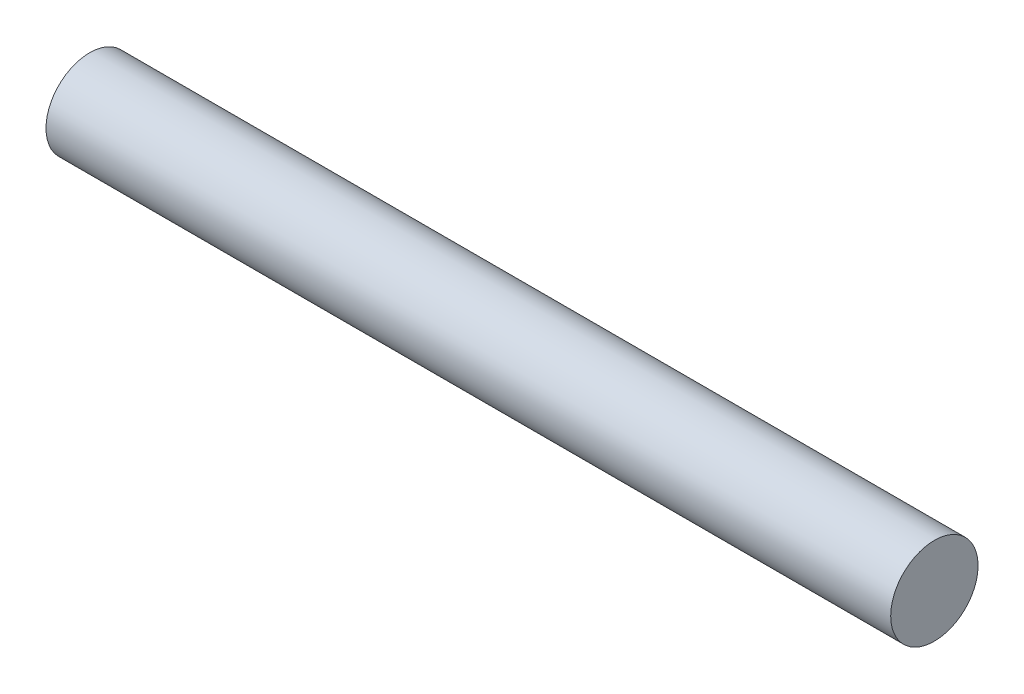
ISO-10303-21;
HEADER;
FILE_DESCRIPTION(('STEP AP214'),'2;1');
FILE_NAME('part.step','',(''),(''),'','','');
FILE_SCHEMA(('AUTOMOTIVE_DESIGN { 1 0 10303 214 1 1 1 1 }'));
ENDSEC;
DATA;
#1=APPLICATION_CONTEXT('core data for automotive mechanical design processes');
#2=APPLICATION_PROTOCOL_DEFINITION('international standard','automotive_design',2000,#1);
#3=PRODUCT_CONTEXT('',#1,'mechanical');
#4=PRODUCT('Part','Part','',(#3));
#5=PRODUCT_RELATED_PRODUCT_CATEGORY('part','',(#4));
#6=PRODUCT_DEFINITION_FORMATION('','',#4);
#7=PRODUCT_DEFINITION_CONTEXT('part definition',#1,'design');
#8=PRODUCT_DEFINITION('design','',#6,#7);
#9=PRODUCT_DEFINITION_SHAPE('','',#8);
#10=(LENGTH_UNIT() NAMED_UNIT(*) SI_UNIT(.MILLI.,.METRE.));
#11=(NAMED_UNIT(*) PLANE_ANGLE_UNIT() SI_UNIT($,.RADIAN.));
#12=(NAMED_UNIT(*) SI_UNIT($,.STERADIAN.) SOLID_ANGLE_UNIT());
#13=UNCERTAINTY_MEASURE_WITH_UNIT(LENGTH_MEASURE(1.E-05),#10,'distance_accuracy_value','');
#14=(GEOMETRIC_REPRESENTATION_CONTEXT(3) GLOBAL_UNCERTAINTY_ASSIGNED_CONTEXT((#13)) GLOBAL_UNIT_ASSIGNED_CONTEXT((#10,
#11,#12)) REPRESENTATION_CONTEXT('',''));
#15=CARTESIAN_POINT('',(0.,0.,0.));
#16=DIRECTION('',(0.,0.,1.));
#17=DIRECTION('',(1.,0.,0.));
#18=AXIS2_PLACEMENT_3D('',#15,#16,#17);
#19=CARTESIAN_POINT('',(116.,0.,0.));
#20=DIRECTION('',(-1.,0.,0.));
#21=DIRECTION('',(0.,0.,1.));
#22=AXIS2_PLACEMENT_3D('',#19,#20,#21);
#23=CYLINDRICAL_SURFACE('',#22,6.);
#24=CARTESIAN_POINT('',(116.,0.,0.));
#25=DIRECTION('',(1.,0.,0.));
#26=DIRECTION('',(0.,0.,-1.));
#27=AXIS2_PLACEMENT_3D('',#24,#25,#26);
#28=CIRCLE('',#27,6.);
#29=CARTESIAN_POINT('',(116.,0.,6.));
#30=VERTEX_POINT('',#29);
#31=EDGE_CURVE('E10',#30,#30,#28,.T.);
#32=CARTESIAN_POINT('',(0.,0.,0.));
#33=DIRECTION('',(1.,0.,0.));
#34=DIRECTION('',(0.,0.,-1.));
#35=AXIS2_PLACEMENT_3D('',#32,#33,#34);
#36=CIRCLE('',#35,6.);
#37=CARTESIAN_POINT('',(0.,0.,6.));
#38=VERTEX_POINT('',#37);
#39=EDGE_CURVE('E34',#38,#38,#36,.T.);
#40=CARTESIAN_POINT('',(116.,0.,6.));
#41=CARTESIAN_POINT('',(114.791666666667,0.,6.));
#42=CARTESIAN_POINT('',(113.583333333333,0.,6.));
#43=CARTESIAN_POINT('',(111.166666666667,0.,6.));
#44=CARTESIAN_POINT('',(109.958333333333,0.,6.));
#45=CARTESIAN_POINT('',(107.541666666667,0.,6.));
#46=CARTESIAN_POINT('',(106.333333333333,0.,6.));
#47=CARTESIAN_POINT('',(103.916666666667,0.,6.));
#48=CARTESIAN_POINT('',(102.708333333333,0.,6.));
#49=CARTESIAN_POINT('',(100.291666666667,0.,6.));
#50=CARTESIAN_POINT('',(99.0833333333333,0.,6.));
#51=CARTESIAN_POINT('',(96.6666666666667,0.,6.));
#52=CARTESIAN_POINT('',(95.4583333333333,0.,6.));
#53=CARTESIAN_POINT('',(93.0416666666667,0.,6.));
#54=CARTESIAN_POINT('',(91.8333333333333,0.,6.));
#55=CARTESIAN_POINT('',(89.4166666666667,0.,6.));
#56=CARTESIAN_POINT('',(88.2083333333333,0.,6.));
#57=CARTESIAN_POINT('',(85.7916666666667,0.,6.));
#58=CARTESIAN_POINT('',(84.5833333333333,0.,6.));
#59=CARTESIAN_POINT('',(82.1666666666667,0.,6.));
#60=CARTESIAN_POINT('',(80.9583333333333,0.,6.));
#61=CARTESIAN_POINT('',(78.5416666666667,0.,6.));
#62=CARTESIAN_POINT('',(77.3333333333333,0.,6.));
#63=CARTESIAN_POINT('',(74.9166666666667,0.,6.));
#64=CARTESIAN_POINT('',(73.7083333333333,0.,6.));
#65=CARTESIAN_POINT('',(71.2916666666667,0.,6.));
#66=CARTESIAN_POINT('',(70.0833333333333,0.,6.));
#67=CARTESIAN_POINT('',(67.6666666666667,0.,6.));
#68=CARTESIAN_POINT('',(66.4583333333333,0.,6.));
#69=CARTESIAN_POINT('',(64.0416666666667,0.,6.));
#70=CARTESIAN_POINT('',(62.8333333333333,0.,6.));
#71=CARTESIAN_POINT('',(60.4166666666667,0.,6.));
#72=CARTESIAN_POINT('',(59.2083333333333,0.,6.));
#73=CARTESIAN_POINT('',(56.7916666666667,0.,6.));
#74=CARTESIAN_POINT('',(55.5833333333333,0.,6.));
#75=CARTESIAN_POINT('',(53.1666666666667,0.,6.));
#76=CARTESIAN_POINT('',(51.9583333333333,0.,6.));
#77=CARTESIAN_POINT('',(49.5416666666667,0.,6.));
#78=CARTESIAN_POINT('',(48.3333333333333,0.,6.));
#79=CARTESIAN_POINT('',(45.9166666666667,0.,6.));
#80=CARTESIAN_POINT('',(44.7083333333333,0.,6.));
#81=CARTESIAN_POINT('',(42.2916666666667,0.,6.));
#82=CARTESIAN_POINT('',(41.0833333333333,0.,6.));
#83=CARTESIAN_POINT('',(38.6666666666667,0.,6.));
#84=CARTESIAN_POINT('',(37.4583333333333,0.,6.));
#85=CARTESIAN_POINT('',(35.0416666666667,0.,6.));
#86=CARTESIAN_POINT('',(33.8333333333333,0.,6.));
#87=CARTESIAN_POINT('',(31.4166666666667,0.,6.));
#88=CARTESIAN_POINT('',(30.2083333333333,0.,6.));
#89=CARTESIAN_POINT('',(27.7916666666667,0.,6.));
#90=CARTESIAN_POINT('',(26.5833333333333,0.,6.));
#91=CARTESIAN_POINT('',(24.1666666666667,0.,6.));
#92=CARTESIAN_POINT('',(22.9583333333333,0.,6.));
#93=CARTESIAN_POINT('',(20.5416666666667,0.,6.));
#94=CARTESIAN_POINT('',(19.3333333333333,0.,6.));
#95=CARTESIAN_POINT('',(16.9166666666667,0.,6.));
#96=CARTESIAN_POINT('',(15.7083333333333,0.,6.));
#97=CARTESIAN_POINT('',(13.2916666666667,0.,6.));
#98=CARTESIAN_POINT('',(12.0833333333333,0.,6.));
#99=CARTESIAN_POINT('',(9.66666666666667,0.,6.));
#100=CARTESIAN_POINT('',(8.45833333333334,0.,6.));
#101=CARTESIAN_POINT('',(6.04166666666667,0.,6.));
#102=CARTESIAN_POINT('',(4.83333333333334,0.,6.));
#103=CARTESIAN_POINT('',(2.41666666666667,0.,6.));
#104=CARTESIAN_POINT('',(1.20833333333333,0.,6.));
#105=CARTESIAN_POINT('',(0.,0.,6.));
#106=B_SPLINE_CURVE_WITH_KNOTS('',3,(#40,#41,#42,#43,#44,#45,#46,#47,#48,#49,#50,#51,#52,#53,
#54,#55,#56,#57,#58,#59,#60,#61,#62,#63,#64,#65,#66,#67,#68,#69,#70,#71,#72,#73,#74,#75,#76,#77,
#78,#79,#80,#81,#82,#83,#84,#85,#86,#87,#88,#89,#90,#91,#92,#93,#94,#95,#96,#97,#98,#99,#100,
#101,#102,#103,#104,#105),.UNSPECIFIED.,.F.,.F.,(4,2,2,2,2,2,2,2,2,2,2,2,2,2,2,2,2,2,2,2,2,2,2,
2,2,2,2,2,2,2,2,2,4),(0.,3.625,7.25000000000001,10.875,14.5,18.125,21.75,25.375,29.,32.625,
36.25,39.875,43.5,47.125,50.75,54.375,58.,61.625,65.25,68.875,72.5,76.125,79.75,83.375,87.,
90.625,94.25,97.875,101.5,105.125,108.75,112.375,116.),.UNSPECIFIED.);
#107=EDGE_CURVE('BSEAM31',#30,#38,#106,.T.);
#108=ORIENTED_EDGE('',*,*,#31,.F.);
#109=ORIENTED_EDGE('',*,*,#39,.T.);
#110=ORIENTED_EDGE('',*,*,#107,.T.);
#111=ORIENTED_EDGE('',*,*,#107,.F.);
#112=EDGE_LOOP('',(#108,#110,#109,#111));
#113=FACE_BOUND('',#112,.T.);
#114=ADVANCED_FACE('F31',(#113),#23,.T.);
#115=CARTESIAN_POINT('',(116.,0.,0.));
#116=DIRECTION('',(1.,0.,0.));
#117=DIRECTION('',(0.,0.,-1.));
#118=AXIS2_PLACEMENT_3D('',#115,#116,#117);
#119=PLANE('',#118);
#120=ORIENTED_EDGE('',*,*,#31,.T.);
#121=EDGE_LOOP('',(#120));
#122=FACE_BOUND('',#121,.T.);
#123=ADVANCED_FACE('F46',(#122),#119,.T.);
#124=CARTESIAN_POINT('',(0.,0.,0.));
#125=DIRECTION('',(1.,0.,0.));
#126=DIRECTION('',(0.,0.,-1.));
#127=AXIS2_PLACEMENT_3D('',#124,#125,#126);
#128=PLANE('',#127);
#129=ORIENTED_EDGE('',*,*,#39,.F.);
#130=EDGE_LOOP('',(#129));
#131=FACE_BOUND('',#130,.T.);
#132=ADVANCED_FACE('F44',(#131),#128,.F.);
#133=CLOSED_SHELL('',(#114,#123,#132));
#134=MANIFOLD_SOLID_BREP('B2',#133);
#135=ADVANCED_BREP_SHAPE_REPRESENTATION('',(#18,#134),#14);
#136=SHAPE_DEFINITION_REPRESENTATION(#9,#135);
ENDSEC;
END-ISO-10303-21;
